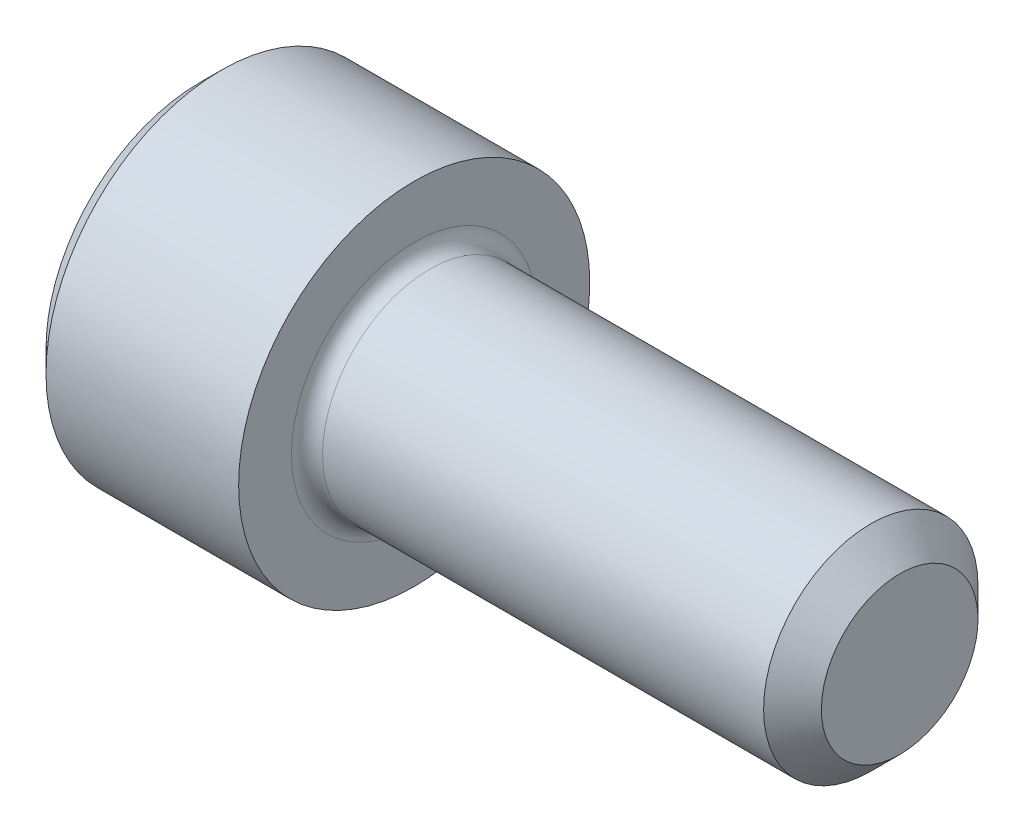
ISO-10303-21;
HEADER;
FILE_DESCRIPTION(('STEP AP214'),'2;1');
FILE_NAME('part.step','',(''),(''),'','','');
FILE_SCHEMA(('AUTOMOTIVE_DESIGN { 1 0 10303 214 1 1 1 1 }'));
ENDSEC;
DATA;
#1=APPLICATION_CONTEXT('core data for automotive mechanical design processes');
#2=APPLICATION_PROTOCOL_DEFINITION('international standard','automotive_design',2000,#1);
#3=PRODUCT_CONTEXT('',#1,'mechanical');
#4=PRODUCT('Part','Part','',(#3));
#5=PRODUCT_RELATED_PRODUCT_CATEGORY('part','',(#4));
#6=PRODUCT_DEFINITION_FORMATION('','',#4);
#7=PRODUCT_DEFINITION_CONTEXT('part definition',#1,'design');
#8=PRODUCT_DEFINITION('design','',#6,#7);
#9=PRODUCT_DEFINITION_SHAPE('','',#8);
#10=(LENGTH_UNIT() NAMED_UNIT(*) SI_UNIT(.MILLI.,.METRE.));
#11=(NAMED_UNIT(*) PLANE_ANGLE_UNIT() SI_UNIT($,.RADIAN.));
#12=(NAMED_UNIT(*) SI_UNIT($,.STERADIAN.) SOLID_ANGLE_UNIT());
#13=UNCERTAINTY_MEASURE_WITH_UNIT(LENGTH_MEASURE(1.E-05),#10,'distance_accuracy_value','');
#14=(GEOMETRIC_REPRESENTATION_CONTEXT(3) GLOBAL_UNCERTAINTY_ASSIGNED_CONTEXT((#13)) GLOBAL_UNIT_ASSIGNED_CONTEXT((#10,
#11,#12)) REPRESENTATION_CONTEXT('',''));
#15=CARTESIAN_POINT('',(0.,0.,0.));
#16=DIRECTION('',(0.,0.,1.));
#17=DIRECTION('',(1.,0.,0.));
#18=AXIS2_PLACEMENT_3D('',#15,#16,#17);
#19=CARTESIAN_POINT('',(-3.5052,0.,0.));
#20=DIRECTION('',(1.,0.,0.));
#21=DIRECTION('',(0.,1.,0.));
#22=AXIS2_PLACEMENT_3D('',#19,#20,#21);
#23=PLANE('',#22);
#24=CARTESIAN_POINT('',(-3.5052,0.,0.));
#25=DIRECTION('',(1.,0.,0.));
#26=DIRECTION('',(0.,1.,0.));
#27=AXIS2_PLACEMENT_3D('',#24,#25,#26);
#28=CIRCLE('',#27,2.51460000000001);
#29=CARTESIAN_POINT('',(-3.5052,2.5146,0.));
#30=VERTEX_POINT('',#29);
#31=EDGE_CURVE('E11',#30,#30,#28,.F.);
#32=ORIENTED_EDGE('',*,*,#31,.T.);
#33=EDGE_LOOP('',(#32));
#34=FACE_BOUND('',#33,.T.);
#35=DIRECTION('',(0.,1.,0.));
#36=VECTOR('',#35,1.);
#37=CARTESIAN_POINT('',(-3.5052,-0.79922597763919,1.3843));
#38=LINE('',#37,#36);
#39=CARTESIAN_POINT('',(-3.5052,-0.79922597763919,1.3843));
#40=VERTEX_POINT('',#39);
#41=CARTESIAN_POINT('',(-3.5052,0.799225977639207,1.3843));
#42=VERTEX_POINT('',#41);
#43=EDGE_CURVE('E133',#40,#42,#38,.T.);
#44=ORIENTED_EDGE('',*,*,#43,.F.);
#45=DIRECTION('',(0.,-0.500000000000001,-0.866025403784438));
#46=VECTOR('',#45,1.);
#47=CARTESIAN_POINT('',(-3.5052,-0.79922597763919,1.3843));
#48=LINE('',#47,#46);
#49=CARTESIAN_POINT('',(-3.5052,-1.59845195527839,0.));
#50=VERTEX_POINT('',#49);
#51=EDGE_CURVE('E283',#40,#50,#48,.T.);
#52=ORIENTED_EDGE('',*,*,#51,.T.);
#53=DIRECTION('',(0.,0.499999999999999,-0.86602540378444));
#54=VECTOR('',#53,1.);
#55=CARTESIAN_POINT('',(-3.5052,-1.59845195527839,0.));
#56=LINE('',#55,#54);
#57=CARTESIAN_POINT('',(-3.5052,-0.799225977639195,-1.3843));
#58=VERTEX_POINT('',#57);
#59=EDGE_CURVE('E286',#50,#58,#56,.T.);
#60=ORIENTED_EDGE('',*,*,#59,.T.);
#61=DIRECTION('',(0.,-1.,0.));
#62=VECTOR('',#61,1.);
#63=CARTESIAN_POINT('',(-3.5052,0.799225977639203,-1.3843));
#64=LINE('',#63,#62);
#65=CARTESIAN_POINT('',(-3.5052,0.799225977639203,-1.3843));
#66=VERTEX_POINT('',#65);
#67=EDGE_CURVE('E289',#66,#58,#64,.T.);
#68=ORIENTED_EDGE('',*,*,#67,.F.);
#69=DIRECTION('',(0.,-0.500000000000001,-0.866025403784438));
#70=VECTOR('',#69,1.);
#71=CARTESIAN_POINT('',(-3.5052,1.5984519552784,0.));
#72=LINE('',#71,#70);
#73=CARTESIAN_POINT('',(-3.5052,1.5984519552784,0.));
#74=VERTEX_POINT('',#73);
#75=EDGE_CURVE('E129',#74,#66,#72,.T.);
#76=ORIENTED_EDGE('',*,*,#75,.F.);
#77=DIRECTION('',(0.,-0.499999999999999,0.866025403784439));
#78=VECTOR('',#77,1.);
#79=CARTESIAN_POINT('',(-3.5052,1.5984519552784,0.));
#80=LINE('',#79,#78);
#81=EDGE_CURVE('E50',#74,#42,#80,.T.);
#82=ORIENTED_EDGE('',*,*,#81,.T.);
#83=EDGE_LOOP('',(#44,#52,#60,#68,#76,#82));
#84=FACE_BOUND('',#83,.T.);
#85=ADVANCED_FACE('F35',(#34,#84),#23,.F.);
#86=CARTESIAN_POINT('',(7.9375,0.,0.));
#87=DIRECTION('',(1.,0.,0.));
#88=DIRECTION('',(0.,1.,0.));
#89=AXIS2_PLACEMENT_3D('',#86,#87,#88);
#90=CYLINDRICAL_SURFACE('',#89,2.87020000000001);
#91=CARTESIAN_POINT('',(-3.14960000000001,0.,0.));
#92=DIRECTION('',(1.,0.,0.));
#93=DIRECTION('',(0.,1.,0.));
#94=AXIS2_PLACEMENT_3D('',#91,#92,#93);
#95=CIRCLE('',#94,2.87020000000001);
#96=CARTESIAN_POINT('',(-3.1496,2.8702,0.));
#97=VERTEX_POINT('',#96);
#98=EDGE_CURVE('E43',#97,#97,#95,.T.);
#99=ORIENTED_EDGE('',*,*,#98,.T.);
#100=EDGE_LOOP('',(#99));
#101=FACE_BOUND('',#100,.T.);
#102=CARTESIAN_POINT('',(0.,0.,0.));
#103=DIRECTION('',(1.,0.,0.));
#104=DIRECTION('',(0.,1.,0.));
#105=AXIS2_PLACEMENT_3D('',#102,#103,#104);
#106=CIRCLE('',#105,2.87020000000001);
#107=CARTESIAN_POINT('',(0.,2.8702,0.));
#108=VERTEX_POINT('',#107);
#109=EDGE_CURVE('E143',#108,#108,#106,.T.);
#110=ORIENTED_EDGE('',*,*,#109,.F.);
#111=EDGE_LOOP('',(#110));
#112=FACE_BOUND('',#111,.T.);
#113=ADVANCED_FACE('F161',(#101,#112),#90,.T.);
#114=CARTESIAN_POINT('',(0.,2.8702,0.));
#115=DIRECTION('',(-1.,0.,0.));
#116=DIRECTION('',(0.,-1.,0.));
#117=AXIS2_PLACEMENT_3D('',#114,#115,#116);
#118=PLANE('',#117);
#119=CARTESIAN_POINT('',(0.,0.,0.));
#120=DIRECTION('',(-1.,0.,0.));
#121=DIRECTION('',(0.,-1.,0.));
#122=AXIS2_PLACEMENT_3D('',#119,#120,#121);
#123=CIRCLE('',#122,2.00660000000001);
#124=CARTESIAN_POINT('',(0.,-2.00660000000001,0.));
#125=VERTEX_POINT('',#124);
#126=EDGE_CURVE('E150',#125,#125,#123,.T.);
#127=ORIENTED_EDGE('',*,*,#126,.T.);
#128=EDGE_LOOP('',(#127));
#129=FACE_BOUND('',#128,.T.);
#130=ORIENTED_EDGE('',*,*,#109,.T.);
#131=EDGE_LOOP('',(#130));
#132=FACE_BOUND('',#131,.T.);
#133=ADVANCED_FACE('F179',(#129,#132),#118,.F.);
#134=CARTESIAN_POINT('',(7.9375,0.,0.));
#135=DIRECTION('',(1.,0.,0.));
#136=DIRECTION('',(0.,1.,0.));
#137=AXIS2_PLACEMENT_3D('',#134,#135,#136);
#138=CYLINDRICAL_SURFACE('',#137,1.75260000000001);
#139=CARTESIAN_POINT('',(7.46506,0.,0.));
#140=DIRECTION('',(-1.,0.,0.));
#141=DIRECTION('',(0.,-1.,0.));
#142=AXIS2_PLACEMENT_3D('',#139,#140,#141);
#143=CIRCLE('',#142,1.75260000000001);
#144=CARTESIAN_POINT('',(7.46506,-1.75260000000001,0.));
#145=VERTEX_POINT('',#144);
#146=EDGE_CURVE('E156',#145,#145,#143,.T.);
#147=ORIENTED_EDGE('',*,*,#146,.T.);
#148=EDGE_LOOP('',(#147));
#149=FACE_BOUND('',#148,.T.);
#150=CARTESIAN_POINT('',(0.253999999999999,0.,0.));
#151=DIRECTION('',(-1.,0.,0.));
#152=DIRECTION('',(0.,-1.,0.));
#153=AXIS2_PLACEMENT_3D('',#150,#151,#152);
#154=CIRCLE('',#153,1.75260000000001);
#155=CARTESIAN_POINT('',(0.253999999999998,-1.75260000000001,0.));
#156=VERTEX_POINT('',#155);
#157=EDGE_CURVE('E147',#156,#156,#154,.F.);
#158=ORIENTED_EDGE('',*,*,#157,.T.);
#159=EDGE_LOOP('',(#158));
#160=FACE_BOUND('',#159,.T.);
#161=ADVANCED_FACE('F197',(#149,#160),#138,.T.);
#162=CARTESIAN_POINT('',(7.9375,1.7526,0.));
#163=DIRECTION('',(-1.,0.,0.));
#164=DIRECTION('',(0.,-1.,0.));
#165=AXIS2_PLACEMENT_3D('',#162,#163,#164);
#166=PLANE('',#165);
#167=CARTESIAN_POINT('',(7.9375,0.,0.));
#168=DIRECTION('',(-1.,0.,0.));
#169=DIRECTION('',(0.,-1.,0.));
#170=AXIS2_PLACEMENT_3D('',#167,#168,#169);
#171=CIRCLE('',#170,1.28016000000001);
#172=CARTESIAN_POINT('',(7.9375,-1.28016000000001,0.));
#173=VERTEX_POINT('',#172);
#174=EDGE_CURVE('E153',#173,#173,#171,.F.);
#175=ORIENTED_EDGE('',*,*,#174,.T.);
#176=EDGE_LOOP('',(#175));
#177=FACE_BOUND('',#176,.T.);
#178=ADVANCED_FACE('F199',(#177),#166,.F.);
#179=CARTESIAN_POINT('',(-1.8796,1.5984519552784,0.));
#180=DIRECTION('',(0.,-0.866025403784439,-0.499999999999999));
#181=DIRECTION('',(0.,0.499999999999999,-0.866025403784439));
#182=AXIS2_PLACEMENT_3D('',#179,#180,#181);
#183=PLANE('',#182);
#184=ORIENTED_EDGE('',*,*,#81,.F.);
#185=DIRECTION('',(-1.,0.,0.));
#186=VECTOR('',#185,1.);
#187=CARTESIAN_POINT('',(-1.8796,1.5984519552784,0.));
#188=LINE('',#187,#186);
#189=CARTESIAN_POINT('',(-1.8796,1.5984519552784,0.));
#190=VERTEX_POINT('',#189);
#191=EDGE_CURVE('E263',#190,#74,#188,.T.);
#192=ORIENTED_EDGE('',*,*,#191,.F.);
#193=DIRECTION('',(0.,-0.499999999999999,0.866025403784439));
#194=VECTOR('',#193,1.);
#195=CARTESIAN_POINT('',(-1.8796,1.5984519552784,0.));
#196=LINE('',#195,#194);
#197=CARTESIAN_POINT('',(-1.8796,1.1988389664588,0.692150000000002));
#198=VERTEX_POINT('',#197);
#199=EDGE_CURVE('E124',#190,#198,#196,.T.);
#200=ORIENTED_EDGE('',*,*,#199,.T.);
#201=CARTESIAN_POINT('',(-1.8796,0.799225977639207,1.3843));
#202=VERTEX_POINT('',#201);
#203=EDGE_CURVE('E115',#198,#202,#196,.T.);
#204=ORIENTED_EDGE('',*,*,#203,.T.);
#205=DIRECTION('',(-1.,0.,0.));
#206=VECTOR('',#205,1.);
#207=CARTESIAN_POINT('',(-1.8796,0.799225977639207,1.3843));
#208=LINE('',#207,#206);
#209=EDGE_CURVE('E127',#202,#42,#208,.T.);
#210=ORIENTED_EDGE('',*,*,#209,.T.);
#211=EDGE_LOOP('',(#184,#192,#200,#204,#210));
#212=FACE_BOUND('',#211,.T.);
#213=ADVANCED_FACE('F126',(#212),#183,.T.);
#214=CARTESIAN_POINT('',(-1.8796,-0.79922597763919,1.3843));
#215=DIRECTION('',(0.,0.,1.));
#216=DIRECTION('',(0.,-1.,0.));
#217=AXIS2_PLACEMENT_3D('',#214,#215,#216);
#218=PLANE('',#217);
#219=ORIENTED_EDGE('',*,*,#43,.T.);
#220=ORIENTED_EDGE('',*,*,#209,.F.);
#221=DIRECTION('',(0.,1.,0.));
#222=VECTOR('',#221,1.);
#223=CARTESIAN_POINT('',(-1.8796,-0.79922597763919,1.3843));
#224=LINE('',#223,#222);
#225=CARTESIAN_POINT('',(-1.8796,0.,1.3843));
#226=VERTEX_POINT('',#225);
#227=EDGE_CURVE('E112',#226,#202,#224,.T.);
#228=ORIENTED_EDGE('',*,*,#227,.F.);
#229=CARTESIAN_POINT('',(-1.8796,-0.79922597763919,1.3843));
#230=VERTEX_POINT('',#229);
#231=EDGE_CURVE('E123',#230,#226,#224,.T.);
#232=ORIENTED_EDGE('',*,*,#231,.F.);
#233=DIRECTION('',(-1.,0.,0.));
#234=VECTOR('',#233,1.);
#235=CARTESIAN_POINT('',(-1.8796,-0.79922597763919,1.3843));
#236=LINE('',#235,#234);
#237=EDGE_CURVE('E135',#230,#40,#236,.T.);
#238=ORIENTED_EDGE('',*,*,#237,.T.);
#239=EDGE_LOOP('',(#219,#220,#228,#232,#238));
#240=FACE_BOUND('',#239,.T.);
#241=ADVANCED_FACE('F131',(#240),#218,.F.);
#242=CARTESIAN_POINT('',(-1.8796,-0.79922597763919,1.3843));
#243=DIRECTION('',(0.,0.866025403784438,-0.500000000000001));
#244=DIRECTION('',(0.,0.500000000000001,0.866025403784438));
#245=AXIS2_PLACEMENT_3D('',#242,#243,#244);
#246=PLANE('',#245);
#247=ORIENTED_EDGE('',*,*,#51,.F.);
#248=ORIENTED_EDGE('',*,*,#237,.F.);
#249=DIRECTION('',(0.,-0.500000000000001,-0.866025403784438));
#250=VECTOR('',#249,1.);
#251=CARTESIAN_POINT('',(-1.8796,-0.79922597763919,1.3843));
#252=LINE('',#251,#250);
#253=CARTESIAN_POINT('',(-1.8796,-1.19883896645879,0.692149999999997));
#254=VERTEX_POINT('',#253);
#255=EDGE_CURVE('E299',#230,#254,#252,.T.);
#256=ORIENTED_EDGE('',*,*,#255,.T.);
#257=CARTESIAN_POINT('',(-1.8796,-1.59845195527839,0.));
#258=VERTEX_POINT('',#257);
#259=EDGE_CURVE('E297',#254,#258,#252,.T.);
#260=ORIENTED_EDGE('',*,*,#259,.T.);
#261=DIRECTION('',(-1.,0.,0.));
#262=VECTOR('',#261,1.);
#263=CARTESIAN_POINT('',(-1.8796,-1.59845195527839,0.));
#264=LINE('',#263,#262);
#265=EDGE_CURVE('E139',#258,#50,#264,.T.);
#266=ORIENTED_EDGE('',*,*,#265,.T.);
#267=EDGE_LOOP('',(#247,#248,#256,#260,#266));
#268=FACE_BOUND('',#267,.T.);
#269=ADVANCED_FACE('F214',(#268),#246,.T.);
#270=CARTESIAN_POINT('',(-1.8796,-1.59845195527839,0.));
#271=DIRECTION('',(0.,0.866025403784439,0.499999999999999));
#272=DIRECTION('',(0.,-0.499999999999999,0.86602540378444));
#273=AXIS2_PLACEMENT_3D('',#270,#271,#272);
#274=PLANE('',#273);
#275=ORIENTED_EDGE('',*,*,#59,.F.);
#276=ORIENTED_EDGE('',*,*,#265,.F.);
#277=DIRECTION('',(0.,0.499999999999999,-0.86602540378444));
#278=VECTOR('',#277,1.);
#279=CARTESIAN_POINT('',(-1.8796,-1.59845195527839,0.));
#280=LINE('',#279,#278);
#281=CARTESIAN_POINT('',(-1.8796,-1.1988389664588,-0.692149999999999));
#282=VERTEX_POINT('',#281);
#283=EDGE_CURVE('E58',#258,#282,#280,.T.);
#284=ORIENTED_EDGE('',*,*,#283,.T.);
#285=CARTESIAN_POINT('',(-1.8796,-0.799225977639195,-1.3843));
#286=VERTEX_POINT('',#285);
#287=EDGE_CURVE('E273',#282,#286,#280,.T.);
#288=ORIENTED_EDGE('',*,*,#287,.T.);
#289=DIRECTION('',(-1.,0.,0.));
#290=VECTOR('',#289,1.);
#291=CARTESIAN_POINT('',(-1.8796,-0.799225977639195,-1.3843));
#292=LINE('',#291,#290);
#293=EDGE_CURVE('E276',#286,#58,#292,.T.);
#294=ORIENTED_EDGE('',*,*,#293,.T.);
#295=EDGE_LOOP('',(#275,#276,#284,#288,#294));
#296=FACE_BOUND('',#295,.T.);
#297=ADVANCED_FACE('F217',(#296),#274,.T.);
#298=CARTESIAN_POINT('',(-1.8796,0.799225977639203,-1.3843));
#299=DIRECTION('',(0.,0.,-1.));
#300=DIRECTION('',(0.,1.,0.));
#301=AXIS2_PLACEMENT_3D('',#298,#299,#300);
#302=PLANE('',#301);
#303=ORIENTED_EDGE('',*,*,#67,.T.);
#304=ORIENTED_EDGE('',*,*,#293,.F.);
#305=DIRECTION('',(0.,-1.,0.));
#306=VECTOR('',#305,1.);
#307=CARTESIAN_POINT('',(-1.8796,0.799225977639203,-1.3843));
#308=LINE('',#307,#306);
#309=CARTESIAN_POINT('',(-1.8796,0.,-1.3843));
#310=VERTEX_POINT('',#309);
#311=EDGE_CURVE('E272',#310,#286,#308,.T.);
#312=ORIENTED_EDGE('',*,*,#311,.F.);
#313=CARTESIAN_POINT('',(-1.8796,0.799225977639203,-1.3843));
#314=VERTEX_POINT('',#313);
#315=EDGE_CURVE('E251',#314,#310,#308,.T.);
#316=ORIENTED_EDGE('',*,*,#315,.F.);
#317=DIRECTION('',(-1.,0.,0.));
#318=VECTOR('',#317,1.);
#319=CARTESIAN_POINT('',(-1.8796,0.799225977639203,-1.3843));
#320=LINE('',#319,#318);
#321=EDGE_CURVE('E261',#314,#66,#320,.T.);
#322=ORIENTED_EDGE('',*,*,#321,.T.);
#323=EDGE_LOOP('',(#303,#304,#312,#316,#322));
#324=FACE_BOUND('',#323,.T.);
#325=ADVANCED_FACE('F221',(#324),#302,.F.);
#326=CARTESIAN_POINT('',(-1.8796,1.5984519552784,0.));
#327=DIRECTION('',(0.,0.866025403784438,-0.500000000000001));
#328=DIRECTION('',(0.,0.500000000000001,0.866025403784438));
#329=AXIS2_PLACEMENT_3D('',#326,#327,#328);
#330=PLANE('',#329);
#331=ORIENTED_EDGE('',*,*,#75,.T.);
#332=ORIENTED_EDGE('',*,*,#321,.F.);
#333=DIRECTION('',(0.,-0.500000000000001,-0.866025403784438));
#334=VECTOR('',#333,1.);
#335=CARTESIAN_POINT('',(-1.8796,1.5984519552784,0.));
#336=LINE('',#335,#334);
#337=CARTESIAN_POINT('',(-1.8796,1.1988389664588,-0.692150000000005));
#338=VERTEX_POINT('',#337);
#339=EDGE_CURVE('E248',#338,#314,#336,.T.);
#340=ORIENTED_EDGE('',*,*,#339,.F.);
#341=EDGE_CURVE('E259',#190,#338,#336,.T.);
#342=ORIENTED_EDGE('',*,*,#341,.F.);
#343=ORIENTED_EDGE('',*,*,#191,.T.);
#344=EDGE_LOOP('',(#331,#332,#340,#342,#343));
#345=FACE_BOUND('',#344,.T.);
#346=ADVANCED_FACE('F224',(#345),#330,.F.);
#347=CARTESIAN_POINT('',(-1.8796,0.,2.7686));
#348=DIRECTION('',(1.,0.,0.));
#349=DIRECTION('',(0.,0.,-1.));
#350=AXIS2_PLACEMENT_3D('',#347,#348,#349);
#351=PLANE('',#350);
#352=CARTESIAN_POINT('',(-1.8796,0.,0.));
#353=DIRECTION('',(1.,0.,0.));
#354=DIRECTION('',(0.,1.,0.));
#355=AXIS2_PLACEMENT_3D('',#352,#353,#354);
#356=CIRCLE('',#355,1.3843);
#357=EDGE_CURVE('E137',#310,#338,#356,.T.);
#358=ORIENTED_EDGE('',*,*,#357,.T.);
#359=ORIENTED_EDGE('',*,*,#339,.T.);
#360=ORIENTED_EDGE('',*,*,#315,.T.);
#361=EDGE_LOOP('',(#358,#359,#360));
#362=FACE_BOUND('',#361,.T.);
#363=ADVANCED_FACE('F228',(#362),#351,.F.);
#364=EDGE_CURVE('E134',#338,#198,#356,.T.);
#365=ORIENTED_EDGE('',*,*,#364,.T.);
#366=ORIENTED_EDGE('',*,*,#199,.F.);
#367=ORIENTED_EDGE('',*,*,#341,.T.);
#368=EDGE_LOOP('',(#365,#366,#367));
#369=FACE_BOUND('',#368,.T.);
#370=ADVANCED_FACE('F239',(#369),#351,.F.);
#371=EDGE_CURVE('E118',#198,#226,#356,.T.);
#372=ORIENTED_EDGE('',*,*,#371,.T.);
#373=ORIENTED_EDGE('',*,*,#227,.T.);
#374=ORIENTED_EDGE('',*,*,#203,.F.);
#375=EDGE_LOOP('',(#372,#373,#374));
#376=FACE_BOUND('',#375,.T.);
#377=ADVANCED_FACE('F114',(#376),#351,.F.);
#378=EDGE_CURVE('E144',#226,#254,#356,.T.);
#379=ORIENTED_EDGE('',*,*,#378,.T.);
#380=ORIENTED_EDGE('',*,*,#255,.F.);
#381=ORIENTED_EDGE('',*,*,#231,.T.);
#382=EDGE_LOOP('',(#379,#380,#381));
#383=FACE_BOUND('',#382,.T.);
#384=ADVANCED_FACE('F236',(#383),#351,.F.);
#385=EDGE_CURVE('E267',#254,#282,#356,.T.);
#386=ORIENTED_EDGE('',*,*,#385,.T.);
#387=ORIENTED_EDGE('',*,*,#283,.F.);
#388=ORIENTED_EDGE('',*,*,#259,.F.);
#389=EDGE_LOOP('',(#386,#387,#388));
#390=FACE_BOUND('',#389,.T.);
#391=ADVANCED_FACE('F231',(#390),#351,.F.);
#392=EDGE_CURVE('E255',#282,#310,#356,.T.);
#393=ORIENTED_EDGE('',*,*,#392,.T.);
#394=ORIENTED_EDGE('',*,*,#311,.T.);
#395=ORIENTED_EDGE('',*,*,#287,.F.);
#396=EDGE_LOOP('',(#393,#394,#395));
#397=FACE_BOUND('',#396,.T.);
#398=ADVANCED_FACE('F190',(#397),#351,.F.);
#399=CARTESIAN_POINT('',(-1.8796,0.,0.));
#400=DIRECTION('',(-1.,0.,0.));
#401=DIRECTION('',(0.,-1.,0.));
#402=AXIS2_PLACEMENT_3D('',#399,#400,#401);
#403=CONICAL_SURFACE('',#402,1.3843,1.04719755119659);
#404=CARTESIAN_POINT('',(-1.08037402236079,0.,0.));
#405=VERTEX_POINT('',#404);
#406=VERTEX_LOOP('',#405);
#407=FACE_BOUND('',#406,.T.);
#408=ORIENTED_EDGE('',*,*,#371,.F.);
#409=ORIENTED_EDGE('',*,*,#364,.F.);
#410=ORIENTED_EDGE('',*,*,#357,.F.);
#411=ORIENTED_EDGE('',*,*,#392,.F.);
#412=ORIENTED_EDGE('',*,*,#385,.F.);
#413=ORIENTED_EDGE('',*,*,#378,.F.);
#414=EDGE_LOOP('',(#408,#409,#410,#411,#412,#413));
#415=FACE_BOUND('',#414,.T.);
#416=ADVANCED_FACE('F185',(#407,#415),#403,.F.);
#417=CARTESIAN_POINT('',(0.253999999999999,0.,0.));
#418=DIRECTION('',(-1.,0.,0.));
#419=DIRECTION('',(0.,-1.,0.));
#420=AXIS2_PLACEMENT_3D('',#417,#418,#419);
#421=TOROIDAL_SURFACE('',#420,2.00660000000001,0.254);
#422=ORIENTED_EDGE('',*,*,#126,.F.);
#423=EDGE_LOOP('',(#422));
#424=FACE_BOUND('',#423,.T.);
#425=ORIENTED_EDGE('',*,*,#157,.F.);
#426=EDGE_LOOP('',(#425));
#427=FACE_BOUND('',#426,.T.);
#428=ADVANCED_FACE('F170',(#424,#427),#421,.F.);
#429=CARTESIAN_POINT('',(7.9375,0.,0.));
#430=DIRECTION('',(-1.,0.,0.));
#431=DIRECTION('',(0.,-1.,0.));
#432=AXIS2_PLACEMENT_3D('',#429,#430,#431);
#433=CONICAL_SURFACE('',#432,1.28016,0.785398163397446);
#434=ORIENTED_EDGE('',*,*,#146,.F.);
#435=EDGE_LOOP('',(#434));
#436=FACE_BOUND('',#435,.T.);
#437=ORIENTED_EDGE('',*,*,#174,.F.);
#438=EDGE_LOOP('',(#437));
#439=FACE_BOUND('',#438,.T.);
#440=ADVANCED_FACE('F165',(#436,#439),#433,.T.);
#441=CARTESIAN_POINT('',(-3.1496,0.,0.));
#442=DIRECTION('',(1.,0.,0.));
#443=DIRECTION('',(0.,1.,0.));
#444=AXIS2_PLACEMENT_3D('',#441,#442,#443);
#445=CONICAL_SURFACE('',#444,2.87020000000001,0.78539816339745);
#446=ORIENTED_EDGE('',*,*,#31,.F.);
#447=EDGE_LOOP('',(#446));
#448=FACE_BOUND('',#447,.T.);
#449=ORIENTED_EDGE('',*,*,#98,.F.);
#450=EDGE_LOOP('',(#449));
#451=FACE_BOUND('',#450,.T.);
#452=ADVANCED_FACE('F37',(#448,#451),#445,.T.);
#453=CLOSED_SHELL('',(#85,#113,#133,#161,#178,#213,#241,#269,#297,#325,#346,#363,#370,#377,#384,
#391,#398,#416,#428,#440,#452));
#454=MANIFOLD_SOLID_BREP('B2',#453);
#455=ADVANCED_BREP_SHAPE_REPRESENTATION('',(#18,#454),#14);
#456=SHAPE_DEFINITION_REPRESENTATION(#9,#455);
ENDSEC;
END-ISO-10303-21;
